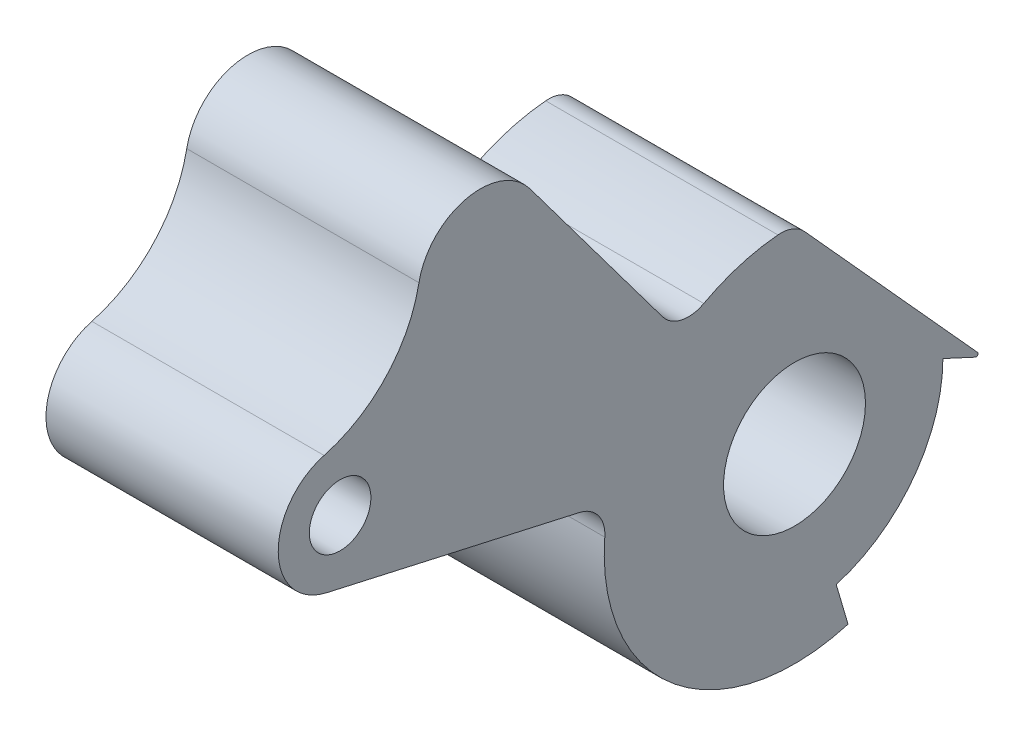
ISO-10303-21;
HEADER;
FILE_DESCRIPTION(('STEP AP214'),'2;1');
FILE_NAME('part.step','',(''),(''),'','','');
FILE_SCHEMA(('AUTOMOTIVE_DESIGN { 1 0 10303 214 1 1 1 1 }'));
ENDSEC;
DATA;
#1=APPLICATION_CONTEXT('core data for automotive mechanical design processes');
#2=APPLICATION_PROTOCOL_DEFINITION('international standard','automotive_design',2000,#1);
#3=PRODUCT_CONTEXT('',#1,'mechanical');
#4=PRODUCT('Part','Part','',(#3));
#5=PRODUCT_RELATED_PRODUCT_CATEGORY('part','',(#4));
#6=PRODUCT_DEFINITION_FORMATION('','',#4);
#7=PRODUCT_DEFINITION_CONTEXT('part definition',#1,'design');
#8=PRODUCT_DEFINITION('design','',#6,#7);
#9=PRODUCT_DEFINITION_SHAPE('','',#8);
#10=(LENGTH_UNIT() NAMED_UNIT(*) SI_UNIT(.MILLI.,.METRE.));
#11=(NAMED_UNIT(*) PLANE_ANGLE_UNIT() SI_UNIT($,.RADIAN.));
#12=(NAMED_UNIT(*) SI_UNIT($,.STERADIAN.) SOLID_ANGLE_UNIT());
#13=UNCERTAINTY_MEASURE_WITH_UNIT(LENGTH_MEASURE(1.E-05),#10,'distance_accuracy_value','');
#14=(GEOMETRIC_REPRESENTATION_CONTEXT(3) GLOBAL_UNCERTAINTY_ASSIGNED_CONTEXT((#13)) GLOBAL_UNIT_ASSIGNED_CONTEXT((#10,
#11,#12)) REPRESENTATION_CONTEXT('',''));
#15=CARTESIAN_POINT('',(0.,0.,0.));
#16=DIRECTION('',(0.,0.,1.));
#17=DIRECTION('',(1.,0.,0.));
#18=AXIS2_PLACEMENT_3D('',#15,#16,#17);
#19=CARTESIAN_POINT('',(9.144,13.8697556198109,19.8620764864467));
#20=DIRECTION('',(-1.,0.,0.));
#21=DIRECTION('',(0.,0.,1.));
#22=AXIS2_PLACEMENT_3D('',#19,#20,#21);
#23=CYLINDRICAL_SURFACE('',#22,5.16618594251631);
#24=CARTESIAN_POINT('',(0.,13.8697556198109,19.8620764864467));
#25=DIRECTION('',(1.,0.,0.));
#26=DIRECTION('',(0.,0.,-1.));
#27=AXIS2_PLACEMENT_3D('',#24,#25,#26);
#28=CIRCLE('',#27,5.16618594251631);
#29=CARTESIAN_POINT('',(0.,8.87993287874129,18.5237393819183));
#30=VERTEX_POINT('',#29);
#31=CARTESIAN_POINT('',(0.,12.901251685911,14.78748514106));
#32=VERTEX_POINT('',#31);
#33=EDGE_CURVE('E146',#30,#32,#28,.T.);
#34=ORIENTED_EDGE('',*,*,#33,.F.);
#35=DIRECTION('',(-1.,0.,0.));
#36=VECTOR('',#35,1.);
#37=CARTESIAN_POINT('',(9.144,8.87993287874129,18.5237393819183));
#38=LINE('',#37,#36);
#39=CARTESIAN_POINT('',(9.144,8.87993287874129,18.5237393819183));
#40=VERTEX_POINT('',#39);
#41=EDGE_CURVE('E142',#40,#30,#38,.T.);
#42=ORIENTED_EDGE('',*,*,#41,.F.);
#43=CARTESIAN_POINT('',(9.144,13.8697556198109,19.8620764864467));
#44=DIRECTION('',(1.,0.,0.));
#45=DIRECTION('',(0.,0.,-1.));
#46=AXIS2_PLACEMENT_3D('',#43,#44,#45);
#47=CIRCLE('',#46,5.16618594251631);
#48=CARTESIAN_POINT('',(9.144,12.901251685911,14.78748514106));
#49=VERTEX_POINT('',#48);
#50=EDGE_CURVE('E144',#40,#49,#47,.T.);
#51=ORIENTED_EDGE('',*,*,#50,.T.);
#52=DIRECTION('',(-1.,0.,0.));
#53=VECTOR('',#52,1.);
#54=CARTESIAN_POINT('',(9.144,12.901251685911,14.78748514106));
#55=LINE('',#54,#53);
#56=EDGE_CURVE('E191',#49,#32,#55,.T.);
#57=ORIENTED_EDGE('',*,*,#56,.T.);
#58=EDGE_LOOP('',(#34,#42,#51,#57));
#59=FACE_BOUND('',#58,.T.);
#60=ADVANCED_FACE('F35',(#59),#23,.F.);
#61=CARTESIAN_POINT('',(9.144,6.52533720599901,17.892205373895));
#62=DIRECTION('',(-1.,0.,0.));
#63=DIRECTION('',(0.,0.,1.));
#64=AXIS2_PLACEMENT_3D('',#61,#62,#63);
#65=CYLINDRICAL_SURFACE('',#64,2.43781787371135);
#66=CARTESIAN_POINT('',(0.,6.52533720599901,17.892205373895));
#67=DIRECTION('',(1.,0.,0.));
#68=DIRECTION('',(0.,0.,-1.));
#69=AXIS2_PLACEMENT_3D('',#66,#67,#68);
#70=CIRCLE('',#69,2.43781787371135);
#71=CARTESIAN_POINT('',(0.,4.14700118429096,18.4274378030625));
#72=VERTEX_POINT('',#71);
#73=EDGE_CURVE('E196',#72,#30,#70,.F.);
#74=ORIENTED_EDGE('',*,*,#73,.F.);
#75=DIRECTION('',(-1.,0.,0.));
#76=VECTOR('',#75,1.);
#77=CARTESIAN_POINT('',(9.144,4.14700118429096,18.4274378030625));
#78=LINE('',#77,#76);
#79=CARTESIAN_POINT('',(9.144,4.14700118429096,18.4274378030625));
#80=VERTEX_POINT('',#79);
#81=EDGE_CURVE('E152',#80,#72,#78,.T.);
#82=ORIENTED_EDGE('',*,*,#81,.F.);
#83=CARTESIAN_POINT('',(9.144,6.52533720599901,17.892205373895));
#84=DIRECTION('',(1.,0.,0.));
#85=DIRECTION('',(0.,0.,-1.));
#86=AXIS2_PLACEMENT_3D('',#83,#84,#85);
#87=CIRCLE('',#86,2.43781787371135);
#88=EDGE_CURVE('E159',#80,#40,#87,.F.);
#89=ORIENTED_EDGE('',*,*,#88,.T.);
#90=ORIENTED_EDGE('',*,*,#41,.T.);
#91=EDGE_LOOP('',(#74,#82,#89,#90));
#92=FACE_BOUND('',#91,.T.);
#93=ADVANCED_FACE('F165',(#92),#65,.T.);
#94=CARTESIAN_POINT('',(9.144,0.,0.));
#95=DIRECTION('',(0.,0.975600370870712,-0.219553903078331));
#96=DIRECTION('',(0.,0.219553903078331,0.975600370870712));
#97=AXIS2_PLACEMENT_3D('',#94,#95,#96);
#98=PLANE('',#97);
#99=DIRECTION('',(0.,-0.219553903078331,-0.975600370870712));
#100=VECTOR('',#99,1.);
#101=CARTESIAN_POINT('',(0.,0.,0.));
#102=LINE('',#101,#100);
#103=CARTESIAN_POINT('',(0.,1.90363830251924,8.45892606736705));
#104=VERTEX_POINT('',#103);
#105=EDGE_CURVE('E198',#72,#104,#102,.T.);
#106=ORIENTED_EDGE('',*,*,#105,.T.);
#107=DIRECTION('',(1.,0.,0.));
#108=VECTOR('',#107,1.);
#109=CARTESIAN_POINT('',(9.144,1.90363830251924,8.45892606736704));
#110=LINE('',#109,#108);
#111=CARTESIAN_POINT('',(9.144,1.90363830251924,8.45892606736705));
#112=VERTEX_POINT('',#111);
#113=EDGE_CURVE('E50',#104,#112,#110,.T.);
#114=ORIENTED_EDGE('',*,*,#113,.T.);
#115=DIRECTION('',(0.,-0.219553903078331,-0.975600370870712));
#116=VECTOR('',#115,1.);
#117=CARTESIAN_POINT('',(9.144,0.,0.));
#118=LINE('',#117,#116);
#119=EDGE_CURVE('E166',#80,#112,#118,.T.);
#120=ORIENTED_EDGE('',*,*,#119,.F.);
#121=ORIENTED_EDGE('',*,*,#81,.T.);
#122=EDGE_LOOP('',(#106,#114,#120,#121));
#123=FACE_BOUND('',#122,.T.);
#124=ADVANCED_FACE('F296',(#123),#98,.F.);
#125=CARTESIAN_POINT('',(9.144,0.,0.));
#126=DIRECTION('',(-1.,0.,0.));
#127=DIRECTION('',(0.,0.,1.));
#128=AXIS2_PLACEMENT_3D('',#125,#126,#127);
#129=CYLINDRICAL_SURFACE('',#128,7.493);
#130=CARTESIAN_POINT('',(9.144,0.,0.));
#131=DIRECTION('',(1.,0.,0.));
#132=DIRECTION('',(0.,0.,-1.));
#133=AXIS2_PLACEMENT_3D('',#130,#131,#132);
#134=CIRCLE('',#133,7.493);
#135=CARTESIAN_POINT('',(9.144,0.56830324723613,7.47141756423645));
#136=VERTEX_POINT('',#135);
#137=CARTESIAN_POINT('',(9.144,-7.19071952423731,-2.10679892817335));
#138=VERTEX_POINT('',#137);
#139=EDGE_CURVE('E168',#136,#138,#134,.T.);
#140=ORIENTED_EDGE('',*,*,#139,.F.);
#141=DIRECTION('',(-1.,0.,0.));
#142=VECTOR('',#141,1.);
#143=CARTESIAN_POINT('',(9.144,0.56830324723613,7.47141756423645));
#144=LINE('',#143,#142);
#145=CARTESIAN_POINT('',(0.,0.56830324723613,7.47141756423645));
#146=VERTEX_POINT('',#145);
#147=EDGE_CURVE('E264',#136,#146,#144,.T.);
#148=ORIENTED_EDGE('',*,*,#147,.T.);
#149=CARTESIAN_POINT('',(0.,0.,0.));
#150=DIRECTION('',(1.,0.,0.));
#151=DIRECTION('',(0.,0.,-1.));
#152=AXIS2_PLACEMENT_3D('',#149,#150,#151);
#153=CIRCLE('',#152,7.493);
#154=CARTESIAN_POINT('',(0.,-7.19071952423731,-2.10679892817335));
#155=VERTEX_POINT('',#154);
#156=EDGE_CURVE('E200',#146,#155,#153,.T.);
#157=ORIENTED_EDGE('',*,*,#156,.T.);
#158=DIRECTION('',(-1.,0.,0.));
#159=VECTOR('',#158,1.);
#160=CARTESIAN_POINT('',(9.144,-7.19071952423731,-2.10679892817335));
#161=LINE('',#160,#159);
#162=EDGE_CURVE('E232',#138,#155,#161,.T.);
#163=ORIENTED_EDGE('',*,*,#162,.F.);
#164=EDGE_LOOP('',(#140,#148,#157,#163));
#165=FACE_BOUND('',#164,.T.);
#166=ADVANCED_FACE('F270',(#165),#129,.T.);
#167=CARTESIAN_POINT('',(9.144,0.,0.));
#168=DIRECTION('',(0.,0.281168948108014,-0.959658284296985));
#169=DIRECTION('',(0.,0.959658284296985,0.281168948108014));
#170=AXIS2_PLACEMENT_3D('',#167,#168,#169);
#171=PLANE('',#170);
#172=DIRECTION('',(0.,-0.959658284296985,-0.281168948108014));
#173=VECTOR('',#172,1.);
#174=CARTESIAN_POINT('',(0.,0.,0.));
#175=LINE('',#174,#173);
#176=CARTESIAN_POINT('',(0.,-5.60632369686299,-1.64258899484702));
#177=VERTEX_POINT('',#176);
#178=EDGE_CURVE('E202',#177,#155,#175,.T.);
#179=ORIENTED_EDGE('',*,*,#178,.F.);
#180=DIRECTION('',(-1.,0.,0.));
#181=VECTOR('',#180,1.);
#182=CARTESIAN_POINT('',(9.144,-5.60632369686299,-1.64258899484702));
#183=LINE('',#182,#181);
#184=CARTESIAN_POINT('',(9.144,-5.60632369686299,-1.64258899484702));
#185=VERTEX_POINT('',#184);
#186=EDGE_CURVE('E230',#185,#177,#183,.T.);
#187=ORIENTED_EDGE('',*,*,#186,.F.);
#188=DIRECTION('',(0.,-0.959658284296985,-0.281168948108014));
#189=VECTOR('',#188,1.);
#190=CARTESIAN_POINT('',(9.144,0.,0.));
#191=LINE('',#190,#189);
#192=EDGE_CURVE('E173',#185,#138,#191,.T.);
#193=ORIENTED_EDGE('',*,*,#192,.T.);
#194=ORIENTED_EDGE('',*,*,#162,.T.);
#195=EDGE_LOOP('',(#179,#187,#193,#194));
#196=FACE_BOUND('',#195,.T.);
#197=ADVANCED_FACE('F280',(#196),#171,.T.);
#198=CARTESIAN_POINT('',(9.144,0.,0.));
#199=DIRECTION('',(-1.,0.,0.));
#200=DIRECTION('',(0.,0.,1.));
#201=AXIS2_PLACEMENT_3D('',#198,#199,#200);
#202=CYLINDRICAL_SURFACE('',#201,5.842);
#203=CARTESIAN_POINT('',(0.,0.,0.));
#204=DIRECTION('',(1.,0.,0.));
#205=DIRECTION('',(0.,0.,-1.));
#206=AXIS2_PLACEMENT_3D('',#203,#204,#205);
#207=CIRCLE('',#206,5.842);
#208=CARTESIAN_POINT('',(0.,0.,-5.842));
#209=VERTEX_POINT('',#208);
#210=EDGE_CURVE('E206',#177,#209,#207,.T.);
#211=ORIENTED_EDGE('',*,*,#210,.T.);
#212=DIRECTION('',(-1.,0.,0.));
#213=VECTOR('',#212,1.);
#214=CARTESIAN_POINT('',(9.144,0.,-5.842));
#215=LINE('',#214,#213);
#216=CARTESIAN_POINT('',(9.144,0.,-5.842));
#217=VERTEX_POINT('',#216);
#218=EDGE_CURVE('E227',#217,#209,#215,.T.);
#219=ORIENTED_EDGE('',*,*,#218,.F.);
#220=CARTESIAN_POINT('',(9.144,0.,0.));
#221=DIRECTION('',(1.,0.,0.));
#222=DIRECTION('',(0.,0.,-1.));
#223=AXIS2_PLACEMENT_3D('',#220,#221,#222);
#224=CIRCLE('',#223,5.842);
#225=EDGE_CURVE('E177',#185,#217,#224,.T.);
#226=ORIENTED_EDGE('',*,*,#225,.F.);
#227=ORIENTED_EDGE('',*,*,#186,.T.);
#228=EDGE_LOOP('',(#211,#219,#226,#227));
#229=FACE_BOUND('',#228,.T.);
#230=ADVANCED_FACE('F334',(#229),#202,.T.);
#231=CARTESIAN_POINT('',(9.144,2.22597558552621,-1.02963179347826));
#232=DIRECTION('',(0.,0.907608695652174,-0.419817169225557));
#233=DIRECTION('',(0.,0.419817169225557,0.907608695652174));
#234=AXIS2_PLACEMENT_3D('',#231,#232,#233);
#235=PLANE('',#234);
#236=DIRECTION('',(0.,-0.419817169225557,-0.907608695652174));
#237=VECTOR('',#236,1.);
#238=CARTESIAN_POINT('',(0.,2.22597558552621,-1.02963179347826));
#239=LINE('',#238,#237);
#240=CARTESIAN_POINT('',(0.,-0.589447889841712,-7.1163357577325));
#241=VERTEX_POINT('',#240);
#242=EDGE_CURVE('E209',#209,#241,#239,.T.);
#243=ORIENTED_EDGE('',*,*,#242,.T.);
#244=DIRECTION('',(-1.,0.,0.));
#245=VECTOR('',#244,1.);
#246=CARTESIAN_POINT('',(9.144,-0.589447889841711,-7.1163357577325));
#247=LINE('',#246,#245);
#248=CARTESIAN_POINT('',(9.144,-0.589447889841712,-7.1163357577325));
#249=VERTEX_POINT('',#248);
#250=EDGE_CURVE('E240',#241,#249,#247,.F.);
#251=ORIENTED_EDGE('',*,*,#250,.T.);
#252=DIRECTION('',(0.,-0.419817169225557,-0.907608695652174));
#253=VECTOR('',#252,1.);
#254=CARTESIAN_POINT('',(9.144,2.22597558552621,-1.02963179347826));
#255=LINE('',#254,#253);
#256=EDGE_CURVE('E180',#217,#249,#255,.T.);
#257=ORIENTED_EDGE('',*,*,#256,.F.);
#258=ORIENTED_EDGE('',*,*,#218,.T.);
#259=EDGE_LOOP('',(#243,#251,#257,#258));
#260=FACE_BOUND('',#259,.T.);
#261=ADVANCED_FACE('F337',(#260),#235,.F.);
#262=CARTESIAN_POINT('',(9.144,3.37328253655848,-3.72786413043478));
#263=DIRECTION('',(0.,-0.670962877745276,0.741490941743578));
#264=DIRECTION('',(0.,-0.741490941743578,-0.670962877745276));
#265=AXIS2_PLACEMENT_3D('',#262,#263,#264);
#266=PLANE('',#265);
#267=DIRECTION('',(0.,0.741490941743578,0.670962877745276));
#268=VECTOR('',#267,1.);
#269=CARTESIAN_POINT('',(0.,3.37328253655848,-3.72786413043478));
#270=LINE('',#269,#268);
#271=CARTESIAN_POINT('',(0.,-0.469160735948826,-7.20482743578835));
#272=VERTEX_POINT('',#271);
#273=CARTESIAN_POINT('',(0.,7.05146149261197,-0.39954088563212));
#274=VERTEX_POINT('',#273);
#275=EDGE_CURVE('E212',#272,#274,#270,.T.);
#276=ORIENTED_EDGE('',*,*,#275,.T.);
#277=DIRECTION('',(-1.,0.,0.));
#278=VECTOR('',#277,1.);
#279=CARTESIAN_POINT('',(9.144,7.05146149261197,-0.39954088563212));
#280=LINE('',#279,#278);
#281=CARTESIAN_POINT('',(9.144,7.05146149261197,-0.39954088563212));
#282=VERTEX_POINT('',#281);
#283=EDGE_CURVE('E260',#274,#282,#280,.F.);
#284=ORIENTED_EDGE('',*,*,#283,.T.);
#285=DIRECTION('',(0.,0.741490941743578,0.670962877745276));
#286=VECTOR('',#285,1.);
#287=CARTESIAN_POINT('',(9.144,3.37328253655848,-3.72786413043478));
#288=LINE('',#287,#286);
#289=CARTESIAN_POINT('',(9.144,-0.469160735948826,-7.20482743578835));
#290=VERTEX_POINT('',#289);
#291=EDGE_CURVE('E183',#290,#282,#288,.T.);
#292=ORIENTED_EDGE('',*,*,#291,.F.);
#293=DIRECTION('',(-1.,0.,0.));
#294=VECTOR('',#293,1.);
#295=CARTESIAN_POINT('',(9.144,-0.469160735948825,-7.20482743578835));
#296=LINE('',#295,#294);
#297=EDGE_CURVE('E151',#290,#272,#296,.T.);
#298=ORIENTED_EDGE('',*,*,#297,.T.);
#299=EDGE_LOOP('',(#276,#284,#292,#298));
#300=FACE_BOUND('',#299,.T.);
#301=ADVANCED_FACE('F341',(#300),#266,.F.);
#302=CARTESIAN_POINT('',(9.144,7.4645097884623,0.652796000256147));
#303=VERTEX_POINT('',#302);
#304=CARTESIAN_POINT('',(9.144,6.58651348511767,3.57251859482397));
#305=VERTEX_POINT('',#304);
#306=EDGE_CURVE('E174',#303,#305,#134,.T.);
#307=ORIENTED_EDGE('',*,*,#306,.F.);
#308=DIRECTION('',(-1.,0.,0.));
#309=VECTOR('',#308,1.);
#310=CARTESIAN_POINT('',(9.144,7.46450978846231,0.652796000256147));
#311=LINE('',#310,#309);
#312=CARTESIAN_POINT('',(0.,7.4645097884623,0.652796000256147));
#313=VERTEX_POINT('',#312);
#314=EDGE_CURVE('E255',#303,#313,#311,.T.);
#315=ORIENTED_EDGE('',*,*,#314,.T.);
#316=CARTESIAN_POINT('',(0.,6.58651348511767,3.57251859482397));
#317=VERTEX_POINT('',#316);
#318=EDGE_CURVE('E203',#313,#317,#153,.T.);
#319=ORIENTED_EDGE('',*,*,#318,.T.);
#320=DIRECTION('',(-1.,0.,0.));
#321=VECTOR('',#320,1.);
#322=CARTESIAN_POINT('',(9.144,6.58651348511767,3.57251859482397));
#323=LINE('',#322,#321);
#324=EDGE_CURVE('E247',#317,#305,#323,.F.);
#325=ORIENTED_EDGE('',*,*,#324,.T.);
#326=EDGE_LOOP('',(#307,#315,#319,#325));
#327=FACE_BOUND('',#326,.T.);
#328=ADVANCED_FACE('F330',(#327),#129,.T.);
#329=CARTESIAN_POINT('',(9.144,0.,0.));
#330=DIRECTION('',(0.,-0.599141610342622,0.800643073258021));
#331=DIRECTION('',(0.,-0.800643073258021,-0.599141610342622));
#332=AXIS2_PLACEMENT_3D('',#329,#330,#331);
#333=PLANE('',#332);
#334=DIRECTION('',(0.,0.800643073258021,0.599141610342622));
#335=VECTOR('',#334,1.);
#336=CARTESIAN_POINT('',(9.144,0.,0.));
#337=LINE('',#336,#335);
#338=CARTESIAN_POINT('',(9.144,6.9419618577991,5.19484692410301));
#339=VERTEX_POINT('',#338);
#340=CARTESIAN_POINT('',(9.144,13.9118663643124,10.410604044156));
#341=VERTEX_POINT('',#340);
#342=EDGE_CURVE('E185',#339,#341,#337,.T.);
#343=ORIENTED_EDGE('',*,*,#342,.F.);
#344=DIRECTION('',(1.,0.,0.));
#345=VECTOR('',#344,1.);
#346=CARTESIAN_POINT('',(0.,6.9419618577991,5.19484692410301));
#347=LINE('',#346,#345);
#348=CARTESIAN_POINT('',(0.,6.9419618577991,5.19484692410301));
#349=VERTEX_POINT('',#348);
#350=EDGE_CURVE('E244',#339,#349,#347,.F.);
#351=ORIENTED_EDGE('',*,*,#350,.T.);
#352=DIRECTION('',(0.,0.800643073258021,0.599141610342622));
#353=VECTOR('',#352,1.);
#354=CARTESIAN_POINT('',(0.,0.,0.));
#355=LINE('',#354,#353);
#356=CARTESIAN_POINT('',(0.,13.9118663643124,10.410604044156));
#357=VERTEX_POINT('',#356);
#358=EDGE_CURVE('E215',#349,#357,#355,.T.);
#359=ORIENTED_EDGE('',*,*,#358,.T.);
#360=DIRECTION('',(-1.,0.,0.));
#361=VECTOR('',#360,1.);
#362=CARTESIAN_POINT('',(9.144,13.9118663643124,10.410604044156));
#363=LINE('',#362,#361);
#364=EDGE_CURVE('E224',#341,#357,#363,.T.);
#365=ORIENTED_EDGE('',*,*,#364,.F.);
#366=EDGE_LOOP('',(#343,#351,#359,#365));
#367=FACE_BOUND('',#366,.T.);
#368=ADVANCED_FACE('F321',(#367),#333,.F.);
#369=CARTESIAN_POINT('',(9.144,12.441031306299,12.3761058233265));
#370=DIRECTION('',(-1.,0.,0.));
#371=DIRECTION('',(0.,0.,1.));
#372=AXIS2_PLACEMENT_3D('',#369,#370,#371);
#373=CYLINDRICAL_SURFACE('',#372,2.45490387017564);
#374=CARTESIAN_POINT('',(0.,12.441031306299,12.3761058233265));
#375=DIRECTION('',(1.,0.,0.));
#376=DIRECTION('',(0.,0.,-1.));
#377=AXIS2_PLACEMENT_3D('',#374,#375,#376);
#378=CIRCLE('',#377,2.45490387017564);
#379=EDGE_CURVE('E217',#357,#32,#378,.T.);
#380=ORIENTED_EDGE('',*,*,#379,.T.);
#381=ORIENTED_EDGE('',*,*,#56,.F.);
#382=CARTESIAN_POINT('',(9.144,12.441031306299,12.3761058233265));
#383=DIRECTION('',(1.,0.,0.));
#384=DIRECTION('',(0.,0.,-1.));
#385=AXIS2_PLACEMENT_3D('',#382,#383,#384);
#386=CIRCLE('',#385,2.45490387017564);
#387=EDGE_CURVE('E161',#341,#49,#386,.T.);
#388=ORIENTED_EDGE('',*,*,#387,.F.);
#389=ORIENTED_EDGE('',*,*,#364,.T.);
#390=EDGE_LOOP('',(#380,#381,#388,#389));
#391=FACE_BOUND('',#390,.T.);
#392=ADVANCED_FACE('F304',(#391),#373,.T.);
#393=CARTESIAN_POINT('',(9.144,6.52533720599901,17.892205373895));
#394=DIRECTION('',(-1.,0.,0.));
#395=DIRECTION('',(0.,0.,1.));
#396=AXIS2_PLACEMENT_3D('',#393,#394,#395);
#397=CYLINDRICAL_SURFACE('',#396,1.21248646484584);
#398=CARTESIAN_POINT('',(9.144,6.52533720599901,17.892205373895));
#399=DIRECTION('',(1.,0.,0.));
#400=DIRECTION('',(0.,0.,-1.));
#401=AXIS2_PLACEMENT_3D('',#398,#399,#400);
#402=CIRCLE('',#401,1.21248646484584);
#403=CARTESIAN_POINT('',(9.144,6.52533720599901,16.6797189090492));
#404=VERTEX_POINT('',#403);
#405=EDGE_CURVE('E163',#404,#404,#402,.T.);
#406=ORIENTED_EDGE('',*,*,#405,.T.);
#407=EDGE_LOOP('',(#406));
#408=FACE_BOUND('',#407,.T.);
#409=CARTESIAN_POINT('',(0.,6.52533720599901,17.892205373895));
#410=DIRECTION('',(1.,0.,0.));
#411=DIRECTION('',(0.,0.,-1.));
#412=AXIS2_PLACEMENT_3D('',#409,#410,#411);
#413=CIRCLE('',#412,1.21248646484584);
#414=CARTESIAN_POINT('',(0.,6.52533720599901,16.6797189090492));
#415=VERTEX_POINT('',#414);
#416=EDGE_CURVE('E192',#415,#415,#413,.T.);
#417=ORIENTED_EDGE('',*,*,#416,.F.);
#418=EDGE_LOOP('',(#417));
#419=FACE_BOUND('',#418,.T.);
#420=ADVANCED_FACE('F300',(#408,#419),#397,.F.);
#421=CARTESIAN_POINT('',(9.144,0.,0.));
#422=DIRECTION('',(-1.,0.,0.));
#423=DIRECTION('',(0.,0.,1.));
#424=AXIS2_PLACEMENT_3D('',#421,#422,#423);
#425=CYLINDRICAL_SURFACE('',#424,2.794);
#426=CARTESIAN_POINT('',(9.144,0.,0.));
#427=DIRECTION('',(1.,0.,0.));
#428=DIRECTION('',(0.,0.,-1.));
#429=AXIS2_PLACEMENT_3D('',#426,#427,#428);
#430=CIRCLE('',#429,2.794);
#431=CARTESIAN_POINT('',(9.144,0.,-2.794));
#432=VERTEX_POINT('',#431);
#433=EDGE_CURVE('E188',#432,#432,#430,.T.);
#434=ORIENTED_EDGE('',*,*,#433,.T.);
#435=EDGE_LOOP('',(#434));
#436=FACE_BOUND('',#435,.T.);
#437=CARTESIAN_POINT('',(0.,0.,0.));
#438=DIRECTION('',(1.,0.,0.));
#439=DIRECTION('',(0.,0.,-1.));
#440=AXIS2_PLACEMENT_3D('',#437,#438,#439);
#441=CIRCLE('',#440,2.794);
#442=CARTESIAN_POINT('',(0.,0.,-2.794));
#443=VERTEX_POINT('',#442);
#444=EDGE_CURVE('E220',#443,#443,#441,.T.);
#445=ORIENTED_EDGE('',*,*,#444,.F.);
#446=EDGE_LOOP('',(#445));
#447=FACE_BOUND('',#446,.T.);
#448=ADVANCED_FACE('F303',(#436,#447),#425,.F.);
#449=CARTESIAN_POINT('',(9.144,0.,0.));
#450=DIRECTION('',(1.,0.,0.));
#451=DIRECTION('',(0.,0.,-1.));
#452=AXIS2_PLACEMENT_3D('',#449,#450,#451);
#453=PLANE('',#452);
#454=ORIENTED_EDGE('',*,*,#405,.F.);
#455=EDGE_LOOP('',(#454));
#456=FACE_BOUND('',#455,.T.);
#457=ORIENTED_EDGE('',*,*,#291,.T.);
#458=CARTESIAN_POINT('',(9.144,6.19933863787547,0.542152610382224));
#459=DIRECTION('',(1.,0.,0.));
#460=DIRECTION('',(0.,0.,-1.));
#461=AXIS2_PLACEMENT_3D('',#458,#459,#460);
#462=CIRCLE('',#461,1.27);
#463=EDGE_CURVE('E262',#282,#303,#462,.T.);
#464=ORIENTED_EDGE('',*,*,#463,.T.);
#465=ORIENTED_EDGE('',*,*,#306,.T.);
#466=CARTESIAN_POINT('',(9.144,7.70287170293423,4.17803022106532));
#467=DIRECTION('',(1.,0.,0.));
#468=DIRECTION('',(0.,0.,-1.));
#469=AXIS2_PLACEMENT_3D('',#466,#467,#468);
#470=CIRCLE('',#469,1.27);
#471=EDGE_CURVE('E253',#305,#339,#470,.F.);
#472=ORIENTED_EDGE('',*,*,#471,.T.);
#473=ORIENTED_EDGE('',*,*,#342,.T.);
#474=ORIENTED_EDGE('',*,*,#387,.T.);
#475=ORIENTED_EDGE('',*,*,#50,.F.);
#476=ORIENTED_EDGE('',*,*,#88,.F.);
#477=ORIENTED_EDGE('',*,*,#119,.T.);
#478=CARTESIAN_POINT('',(9.144,0.66462583151344,8.73775952427652));
#479=DIRECTION('',(1.,0.,0.));
#480=DIRECTION('',(0.,0.,-1.));
#481=AXIS2_PLACEMENT_3D('',#478,#479,#480);
#482=CIRCLE('',#481,1.27);
#483=EDGE_CURVE('E11',#112,#136,#482,.F.);
#484=ORIENTED_EDGE('',*,*,#483,.T.);
#485=ORIENTED_EDGE('',*,*,#139,.T.);
#486=ORIENTED_EDGE('',*,*,#192,.F.);
#487=ORIENTED_EDGE('',*,*,#225,.T.);
#488=ORIENTED_EDGE('',*,*,#256,.T.);
#489=CARTESIAN_POINT('',(9.144,-0.520288107233016,-7.14832582602748));
#490=DIRECTION('',(1.,0.,0.));
#491=DIRECTION('',(0.,0.,-1.));
#492=AXIS2_PLACEMENT_3D('',#489,#490,#491);
#493=CIRCLE('',#492,0.0762);
#494=EDGE_CURVE('E242',#249,#290,#493,.T.);
#495=ORIENTED_EDGE('',*,*,#494,.T.);
#496=EDGE_LOOP('',(#457,#464,#465,#472,#473,#474,#475,#476,#477,#484,#485,#486,#487,#488,#495));
#497=FACE_BOUND('',#496,.T.);
#498=ORIENTED_EDGE('',*,*,#433,.F.);
#499=EDGE_LOOP('',(#498));
#500=FACE_BOUND('',#499,.T.);
#501=ADVANCED_FACE('F157',(#456,#497,#500),#453,.T.);
#502=CARTESIAN_POINT('',(0.,0.,0.));
#503=DIRECTION('',(1.,0.,0.));
#504=DIRECTION('',(0.,0.,-1.));
#505=AXIS2_PLACEMENT_3D('',#502,#503,#504);
#506=PLANE('',#505);
#507=ORIENTED_EDGE('',*,*,#416,.T.);
#508=EDGE_LOOP('',(#507));
#509=FACE_BOUND('',#508,.T.);
#510=ORIENTED_EDGE('',*,*,#318,.F.);
#511=CARTESIAN_POINT('',(0.,6.19933863787547,0.542152610382224));
#512=DIRECTION('',(1.,0.,0.));
#513=DIRECTION('',(0.,0.,-1.));
#514=AXIS2_PLACEMENT_3D('',#511,#512,#513);
#515=CIRCLE('',#514,1.27);
#516=EDGE_CURVE('E258',#313,#274,#515,.F.);
#517=ORIENTED_EDGE('',*,*,#516,.T.);
#518=ORIENTED_EDGE('',*,*,#275,.F.);
#519=CARTESIAN_POINT('',(0.,-0.520288107233016,-7.14832582602748));
#520=DIRECTION('',(1.,0.,0.));
#521=DIRECTION('',(0.,0.,-1.));
#522=AXIS2_PLACEMENT_3D('',#519,#520,#521);
#523=CIRCLE('',#522,0.0762);
#524=EDGE_CURVE('E238',#272,#241,#523,.F.);
#525=ORIENTED_EDGE('',*,*,#524,.T.);
#526=ORIENTED_EDGE('',*,*,#242,.F.);
#527=ORIENTED_EDGE('',*,*,#210,.F.);
#528=ORIENTED_EDGE('',*,*,#178,.T.);
#529=ORIENTED_EDGE('',*,*,#156,.F.);
#530=CARTESIAN_POINT('',(0.,0.66462583151344,8.73775952427652));
#531=DIRECTION('',(1.,0.,0.));
#532=DIRECTION('',(0.,0.,-1.));
#533=AXIS2_PLACEMENT_3D('',#530,#531,#532);
#534=CIRCLE('',#533,1.27);
#535=EDGE_CURVE('E43',#146,#104,#534,.T.);
#536=ORIENTED_EDGE('',*,*,#535,.T.);
#537=ORIENTED_EDGE('',*,*,#105,.F.);
#538=ORIENTED_EDGE('',*,*,#73,.T.);
#539=ORIENTED_EDGE('',*,*,#33,.T.);
#540=ORIENTED_EDGE('',*,*,#379,.F.);
#541=ORIENTED_EDGE('',*,*,#358,.F.);
#542=CARTESIAN_POINT('',(0.,7.70287170293423,4.17803022106532));
#543=DIRECTION('',(1.,0.,0.));
#544=DIRECTION('',(0.,0.,-1.));
#545=AXIS2_PLACEMENT_3D('',#542,#543,#544);
#546=CIRCLE('',#545,1.27);
#547=EDGE_CURVE('E250',#349,#317,#546,.T.);
#548=ORIENTED_EDGE('',*,*,#547,.T.);
#549=EDGE_LOOP('',(#510,#517,#518,#525,#526,#527,#528,#529,#536,#537,#538,#539,#540,#541,#548));
#550=FACE_BOUND('',#549,.T.);
#551=ORIENTED_EDGE('',*,*,#444,.T.);
#552=EDGE_LOOP('',(#551));
#553=FACE_BOUND('',#552,.T.);
#554=ADVANCED_FACE('F275',(#509,#550,#553),#506,.F.);
#555=CARTESIAN_POINT('',(9.144,-0.520288107233016,-7.14832582602748));
#556=DIRECTION('',(-1.,0.,0.));
#557=DIRECTION('',(0.,0.,1.));
#558=AXIS2_PLACEMENT_3D('',#555,#556,#557);
#559=CYLINDRICAL_SURFACE('',#558,0.0762);
#560=ORIENTED_EDGE('',*,*,#494,.F.);
#561=ORIENTED_EDGE('',*,*,#250,.F.);
#562=ORIENTED_EDGE('',*,*,#524,.F.);
#563=ORIENTED_EDGE('',*,*,#297,.F.);
#564=EDGE_LOOP('',(#560,#561,#562,#563));
#565=FACE_BOUND('',#564,.T.);
#566=ADVANCED_FACE('F306',(#565),#559,.T.);
#567=CARTESIAN_POINT('',(9.144,7.70287170293423,4.17803022106532));
#568=DIRECTION('',(-1.,0.,0.));
#569=DIRECTION('',(0.,0.,1.));
#570=AXIS2_PLACEMENT_3D('',#567,#568,#569);
#571=CYLINDRICAL_SURFACE('',#570,1.27);
#572=ORIENTED_EDGE('',*,*,#471,.F.);
#573=ORIENTED_EDGE('',*,*,#324,.F.);
#574=ORIENTED_EDGE('',*,*,#547,.F.);
#575=ORIENTED_EDGE('',*,*,#350,.F.);
#576=EDGE_LOOP('',(#572,#573,#574,#575));
#577=FACE_BOUND('',#576,.T.);
#578=ADVANCED_FACE('F289',(#577),#571,.F.);
#579=CARTESIAN_POINT('',(9.144,6.19933863787547,0.542152610382224));
#580=DIRECTION('',(-1.,0.,0.));
#581=DIRECTION('',(0.,0.,1.));
#582=AXIS2_PLACEMENT_3D('',#579,#580,#581);
#583=CYLINDRICAL_SURFACE('',#582,1.27);
#584=ORIENTED_EDGE('',*,*,#463,.F.);
#585=ORIENTED_EDGE('',*,*,#283,.F.);
#586=ORIENTED_EDGE('',*,*,#516,.F.);
#587=ORIENTED_EDGE('',*,*,#314,.F.);
#588=EDGE_LOOP('',(#584,#585,#586,#587));
#589=FACE_BOUND('',#588,.T.);
#590=ADVANCED_FACE('F285',(#589),#583,.T.);
#591=CARTESIAN_POINT('',(9.144,0.66462583151344,8.73775952427652));
#592=DIRECTION('',(-1.,0.,0.));
#593=DIRECTION('',(0.,0.,1.));
#594=AXIS2_PLACEMENT_3D('',#591,#592,#593);
#595=CYLINDRICAL_SURFACE('',#594,1.27);
#596=ORIENTED_EDGE('',*,*,#483,.F.);
#597=ORIENTED_EDGE('',*,*,#113,.F.);
#598=ORIENTED_EDGE('',*,*,#535,.F.);
#599=ORIENTED_EDGE('',*,*,#147,.F.);
#600=EDGE_LOOP('',(#596,#597,#598,#599));
#601=FACE_BOUND('',#600,.T.);
#602=ADVANCED_FACE('F37',(#601),#595,.F.);
#603=CLOSED_SHELL('',(#60,#93,#124,#166,#197,#230,#261,#301,#328,#368,#392,#420,#448,#501,#554,
#566,#578,#590,#602));
#604=MANIFOLD_SOLID_BREP('B2',#603);
#605=ADVANCED_BREP_SHAPE_REPRESENTATION('',(#18,#604),#14);
#606=SHAPE_DEFINITION_REPRESENTATION(#9,#605);
ENDSEC;
END-ISO-10303-21;
